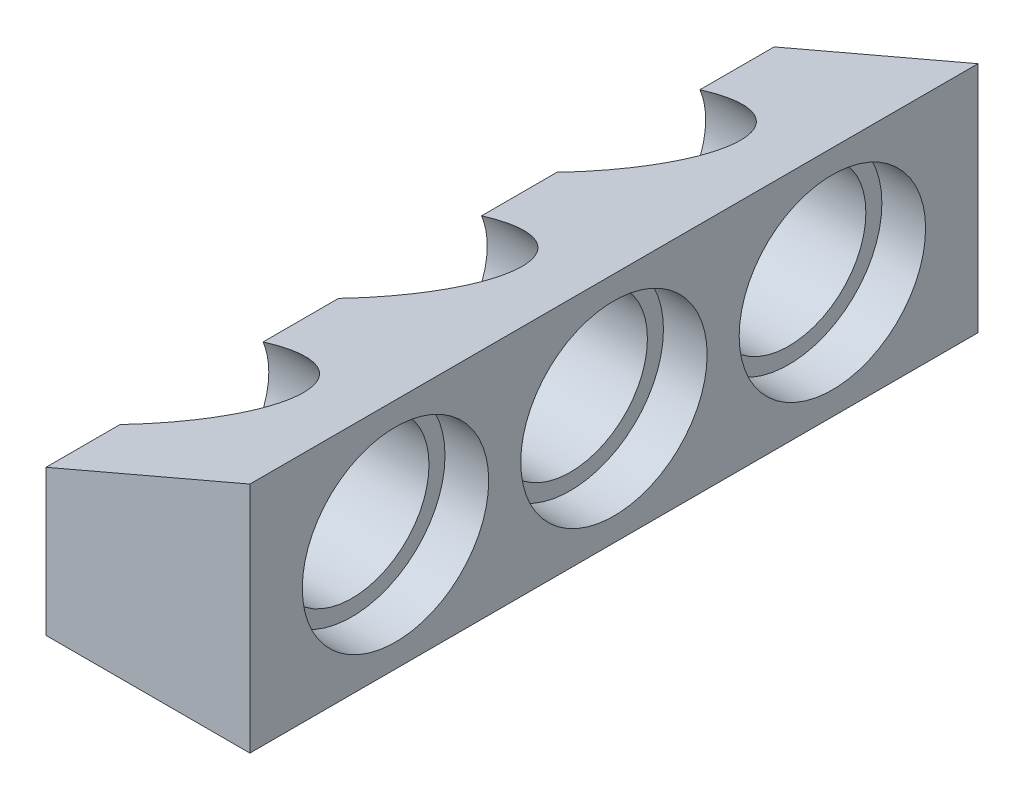
ISO-10303-21;
HEADER;
FILE_DESCRIPTION(('STEP AP214'),'2;1');
FILE_NAME('part.step','',(''),(''),'','','');
FILE_SCHEMA(('AUTOMOTIVE_DESIGN { 1 0 10303 214 1 1 1 1 }'));
ENDSEC;
DATA;
#1=APPLICATION_CONTEXT('core data for automotive mechanical design processes');
#2=APPLICATION_PROTOCOL_DEFINITION('international standard','automotive_design',2000,#1);
#3=PRODUCT_CONTEXT('',#1,'mechanical');
#4=PRODUCT('Part','Part','',(#3));
#5=PRODUCT_RELATED_PRODUCT_CATEGORY('part','',(#4));
#6=PRODUCT_DEFINITION_FORMATION('','',#4);
#7=PRODUCT_DEFINITION_CONTEXT('part definition',#1,'design');
#8=PRODUCT_DEFINITION('design','',#6,#7);
#9=PRODUCT_DEFINITION_SHAPE('','',#8);
#10=(LENGTH_UNIT() NAMED_UNIT(*) SI_UNIT(.MILLI.,.METRE.));
#11=(NAMED_UNIT(*) PLANE_ANGLE_UNIT() SI_UNIT($,.RADIAN.));
#12=(NAMED_UNIT(*) SI_UNIT($,.STERADIAN.) SOLID_ANGLE_UNIT());
#13=UNCERTAINTY_MEASURE_WITH_UNIT(LENGTH_MEASURE(1.E-05),#10,'distance_accuracy_value','');
#14=(GEOMETRIC_REPRESENTATION_CONTEXT(3) GLOBAL_UNCERTAINTY_ASSIGNED_CONTEXT((#13)) GLOBAL_UNIT_ASSIGNED_CONTEXT((#10,
#11,#12)) REPRESENTATION_CONTEXT('',''));
#15=CARTESIAN_POINT('',(0.,0.,0.));
#16=DIRECTION('',(0.,0.,1.));
#17=DIRECTION('',(1.,0.,0.));
#18=AXIS2_PLACEMENT_3D('',#15,#16,#17);
#19=CARTESIAN_POINT('',(7.,4.,20.));
#20=DIRECTION('',(-1.,0.,0.));
#21=DIRECTION('',(0.,-1.,0.));
#22=AXIS2_PLACEMENT_3D('',#19,#20,#21);
#23=CYLINDRICAL_SURFACE('',#22,2.65);
#24=CARTESIAN_POINT('',(0.,4.,20.));
#25=DIRECTION('',(-1.,0.,0.));
#26=DIRECTION('',(0.,-1.,0.));
#27=AXIS2_PLACEMENT_3D('',#24,#25,#26);
#28=CIRCLE('',#27,2.65);
#29=CARTESIAN_POINT('',(0.,5.,17.5459217616384));
#30=VERTEX_POINT('',#29);
#31=CARTESIAN_POINT('',(0.,5.,22.4540782383616));
#32=VERTEX_POINT('',#31);
#33=EDGE_CURVE('E102',#30,#32,#28,.T.);
#34=ORIENTED_EDGE('',*,*,#33,.T.);
#35=CARTESIAN_POINT('',(-2.33333333333334,4.,20.));
#36=DIRECTION('',(0.393919298579168,-0.919145030018058,0.));
#37=DIRECTION('',(-0.919145030018058,-0.393919298579168,0.));
#38=AXIS2_PLACEMENT_3D('',#35,#36,#37);
#39=ELLIPSE('',#38,6.72726624351312,2.65);
#40=EDGE_CURVE('E99',#30,#32,#39,.T.);
#41=ORIENTED_EDGE('',*,*,#40,.F.);
#42=EDGE_LOOP('',(#34,#41));
#43=FACE_BOUND('',#42,.T.);
#44=CARTESIAN_POINT('',(5.5,4.,20.));
#45=DIRECTION('',(1.,0.,0.));
#46=DIRECTION('',(0.,0.,-1.));
#47=AXIS2_PLACEMENT_3D('',#44,#45,#46);
#48=CIRCLE('',#47,2.65);
#49=CARTESIAN_POINT('',(5.5,4.,17.35));
#50=VERTEX_POINT('',#49);
#51=EDGE_CURVE('E43',#50,#50,#48,.F.);
#52=ORIENTED_EDGE('',*,*,#51,.F.);
#53=EDGE_LOOP('',(#52));
#54=FACE_BOUND('',#53,.T.);
#55=ADVANCED_FACE('F39',(#43,#54),#23,.F.);
#56=CARTESIAN_POINT('',(7.,4.,12.5));
#57=DIRECTION('',(-1.,0.,0.));
#58=DIRECTION('',(0.,-1.,0.));
#59=AXIS2_PLACEMENT_3D('',#56,#57,#58);
#60=CYLINDRICAL_SURFACE('',#59,2.65);
#61=CARTESIAN_POINT('',(0.,4.,12.5));
#62=DIRECTION('',(-1.,0.,0.));
#63=DIRECTION('',(0.,-1.,0.));
#64=AXIS2_PLACEMENT_3D('',#61,#62,#63);
#65=CIRCLE('',#64,2.65);
#66=CARTESIAN_POINT('',(0.,5.,10.0459217616384));
#67=VERTEX_POINT('',#66);
#68=CARTESIAN_POINT('',(0.,5.,14.9540782383616));
#69=VERTEX_POINT('',#68);
#70=EDGE_CURVE('E62',#67,#69,#65,.T.);
#71=ORIENTED_EDGE('',*,*,#70,.T.);
#72=CARTESIAN_POINT('',(-2.33333333333334,4.,12.5));
#73=DIRECTION('',(0.393919298579168,-0.919145030018058,0.));
#74=DIRECTION('',(-0.919145030018058,-0.393919298579168,0.));
#75=AXIS2_PLACEMENT_3D('',#72,#73,#74);
#76=ELLIPSE('',#75,6.72726624351311,2.65);
#77=EDGE_CURVE('E49',#67,#69,#76,.T.);
#78=ORIENTED_EDGE('',*,*,#77,.F.);
#79=EDGE_LOOP('',(#71,#78));
#80=FACE_BOUND('',#79,.T.);
#81=CARTESIAN_POINT('',(5.5,4.,12.5));
#82=DIRECTION('',(1.,0.,0.));
#83=DIRECTION('',(0.,0.,-1.));
#84=AXIS2_PLACEMENT_3D('',#81,#82,#83);
#85=CIRCLE('',#84,2.65);
#86=CARTESIAN_POINT('',(5.5,4.,9.85));
#87=VERTEX_POINT('',#86);
#88=EDGE_CURVE('E148',#87,#87,#85,.F.);
#89=ORIENTED_EDGE('',*,*,#88,.F.);
#90=EDGE_LOOP('',(#89));
#91=FACE_BOUND('',#90,.T.);
#92=ADVANCED_FACE('F162',(#80,#91),#60,.F.);
#93=CARTESIAN_POINT('',(7.,4.,5.));
#94=DIRECTION('',(-1.,0.,0.));
#95=DIRECTION('',(0.,-1.,0.));
#96=AXIS2_PLACEMENT_3D('',#93,#94,#95);
#97=CYLINDRICAL_SURFACE('',#96,2.65);
#98=CARTESIAN_POINT('',(0.,4.,5.));
#99=DIRECTION('',(-1.,0.,0.));
#100=DIRECTION('',(0.,-1.,0.));
#101=AXIS2_PLACEMENT_3D('',#98,#99,#100);
#102=CIRCLE('',#101,2.65);
#103=CARTESIAN_POINT('',(0.,5.,2.54592176163839));
#104=VERTEX_POINT('',#103);
#105=CARTESIAN_POINT('',(0.,5.,7.4540782383616));
#106=VERTEX_POINT('',#105);
#107=EDGE_CURVE('E56',#104,#106,#102,.T.);
#108=ORIENTED_EDGE('',*,*,#107,.T.);
#109=CARTESIAN_POINT('',(-2.33333333333334,4.,5.));
#110=DIRECTION('',(0.393919298579168,-0.919145030018058,0.));
#111=DIRECTION('',(-0.919145030018058,-0.393919298579168,0.));
#112=AXIS2_PLACEMENT_3D('',#109,#110,#111);
#113=ELLIPSE('',#112,6.72726624351312,2.65);
#114=EDGE_CURVE('E11',#104,#106,#113,.T.);
#115=ORIENTED_EDGE('',*,*,#114,.F.);
#116=EDGE_LOOP('',(#108,#115));
#117=FACE_BOUND('',#116,.T.);
#118=CARTESIAN_POINT('',(5.5,4.,5.));
#119=DIRECTION('',(1.,0.,0.));
#120=DIRECTION('',(0.,0.,-1.));
#121=AXIS2_PLACEMENT_3D('',#118,#119,#120);
#122=CIRCLE('',#121,2.65);
#123=CARTESIAN_POINT('',(5.5,4.,2.35));
#124=VERTEX_POINT('',#123);
#125=EDGE_CURVE('E145',#124,#124,#122,.F.);
#126=ORIENTED_EDGE('',*,*,#125,.F.);
#127=EDGE_LOOP('',(#126));
#128=FACE_BOUND('',#127,.T.);
#129=ADVANCED_FACE('F167',(#117,#128),#97,.F.);
#130=CARTESIAN_POINT('',(0.,5.,25.));
#131=DIRECTION('',(1.,0.,0.));
#132=DIRECTION('',(0.,1.,0.));
#133=AXIS2_PLACEMENT_3D('',#130,#131,#132);
#134=PLANE('',#133);
#135=DIRECTION('',(0.,0.,-1.));
#136=VECTOR('',#135,1.);
#137=CARTESIAN_POINT('',(0.,5.,25.));
#138=LINE('',#137,#136);
#139=EDGE_CURVE('E122',#67,#106,#138,.T.);
#140=ORIENTED_EDGE('',*,*,#139,.T.);
#141=ORIENTED_EDGE('',*,*,#107,.F.);
#142=CARTESIAN_POINT('',(0.,5.,0.));
#143=VERTEX_POINT('',#142);
#144=EDGE_CURVE('E128',#104,#143,#138,.T.);
#145=ORIENTED_EDGE('',*,*,#144,.T.);
#146=DIRECTION('',(0.,-1.,0.));
#147=VECTOR('',#146,1.);
#148=CARTESIAN_POINT('',(0.,5.,0.));
#149=LINE('',#148,#147);
#150=CARTESIAN_POINT('',(0.,0.,0.));
#151=VERTEX_POINT('',#150);
#152=EDGE_CURVE('E200',#143,#151,#149,.T.);
#153=ORIENTED_EDGE('',*,*,#152,.T.);
#154=DIRECTION('',(0.,0.,-1.));
#155=VECTOR('',#154,1.);
#156=CARTESIAN_POINT('',(0.,0.,25.));
#157=LINE('',#156,#155);
#158=CARTESIAN_POINT('',(0.,0.,25.));
#159=VERTEX_POINT('',#158);
#160=EDGE_CURVE('E108',#159,#151,#157,.T.);
#161=ORIENTED_EDGE('',*,*,#160,.F.);
#162=DIRECTION('',(0.,-1.,0.));
#163=VECTOR('',#162,1.);
#164=CARTESIAN_POINT('',(0.,5.,25.));
#165=LINE('',#164,#163);
#166=CARTESIAN_POINT('',(0.,5.,25.));
#167=VERTEX_POINT('',#166);
#168=EDGE_CURVE('E210',#167,#159,#165,.T.);
#169=ORIENTED_EDGE('',*,*,#168,.F.);
#170=EDGE_CURVE('E115',#167,#32,#138,.T.);
#171=ORIENTED_EDGE('',*,*,#170,.T.);
#172=ORIENTED_EDGE('',*,*,#33,.F.);
#173=EDGE_CURVE('E113',#30,#69,#138,.T.);
#174=ORIENTED_EDGE('',*,*,#173,.T.);
#175=ORIENTED_EDGE('',*,*,#70,.F.);
#176=EDGE_LOOP('',(#140,#141,#145,#153,#161,#169,#171,#172,#174,#175));
#177=FACE_BOUND('',#176,.T.);
#178=ADVANCED_FACE('F41',(#177),#134,.F.);
#179=CARTESIAN_POINT('',(0.,0.,25.));
#180=DIRECTION('',(0.,1.,0.));
#181=DIRECTION('',(0.,0.,1.));
#182=AXIS2_PLACEMENT_3D('',#179,#180,#181);
#183=PLANE('',#182);
#184=DIRECTION('',(1.,0.,0.));
#185=VECTOR('',#184,1.);
#186=CARTESIAN_POINT('',(0.,0.,0.));
#187=LINE('',#186,#185);
#188=CARTESIAN_POINT('',(7.,0.,0.));
#189=VERTEX_POINT('',#188);
#190=EDGE_CURVE('E192',#151,#189,#187,.T.);
#191=ORIENTED_EDGE('',*,*,#190,.T.);
#192=DIRECTION('',(0.,0.,-1.));
#193=VECTOR('',#192,1.);
#194=CARTESIAN_POINT('',(7.,0.,25.));
#195=LINE('',#194,#193);
#196=CARTESIAN_POINT('',(7.,0.,25.));
#197=VERTEX_POINT('',#196);
#198=EDGE_CURVE('E136',#197,#189,#195,.T.);
#199=ORIENTED_EDGE('',*,*,#198,.F.);
#200=DIRECTION('',(1.,0.,0.));
#201=VECTOR('',#200,1.);
#202=CARTESIAN_POINT('',(0.,0.,25.));
#203=LINE('',#202,#201);
#204=EDGE_CURVE('E219',#159,#197,#203,.T.);
#205=ORIENTED_EDGE('',*,*,#204,.F.);
#206=ORIENTED_EDGE('',*,*,#160,.T.);
#207=EDGE_LOOP('',(#191,#199,#205,#206));
#208=FACE_BOUND('',#207,.T.);
#209=ADVANCED_FACE('F184',(#208),#183,.F.);
#210=CARTESIAN_POINT('',(7.,0.,25.));
#211=DIRECTION('',(-1.,0.,0.));
#212=DIRECTION('',(0.,0.,1.));
#213=AXIS2_PLACEMENT_3D('',#210,#211,#212);
#214=PLANE('',#213);
#215=CARTESIAN_POINT('',(7.,4.,20.));
#216=DIRECTION('',(1.,0.,0.));
#217=DIRECTION('',(0.,0.,-1.));
#218=AXIS2_PLACEMENT_3D('',#215,#216,#217);
#219=CIRCLE('',#218,3.2);
#220=CARTESIAN_POINT('',(7.,4.,16.8));
#221=VERTEX_POINT('',#220);
#222=EDGE_CURVE('E245',#221,#221,#219,.T.);
#223=ORIENTED_EDGE('',*,*,#222,.F.);
#224=EDGE_LOOP('',(#223));
#225=FACE_BOUND('',#224,.T.);
#226=CARTESIAN_POINT('',(7.,4.,12.5));
#227=DIRECTION('',(1.,0.,0.));
#228=DIRECTION('',(0.,0.,-1.));
#229=AXIS2_PLACEMENT_3D('',#226,#227,#228);
#230=CIRCLE('',#229,3.2);
#231=CARTESIAN_POINT('',(7.,4.,9.3));
#232=VERTEX_POINT('',#231);
#233=EDGE_CURVE('E237',#232,#232,#230,.T.);
#234=ORIENTED_EDGE('',*,*,#233,.F.);
#235=EDGE_LOOP('',(#234));
#236=FACE_BOUND('',#235,.T.);
#237=CARTESIAN_POINT('',(7.,4.,5.));
#238=DIRECTION('',(1.,0.,0.));
#239=DIRECTION('',(0.,0.,-1.));
#240=AXIS2_PLACEMENT_3D('',#237,#238,#239);
#241=CIRCLE('',#240,3.2);
#242=CARTESIAN_POINT('',(7.,4.,1.8));
#243=VERTEX_POINT('',#242);
#244=EDGE_CURVE('E229',#243,#243,#241,.T.);
#245=ORIENTED_EDGE('',*,*,#244,.F.);
#246=EDGE_LOOP('',(#245));
#247=FACE_BOUND('',#246,.T.);
#248=DIRECTION('',(0.,1.,0.));
#249=VECTOR('',#248,1.);
#250=CARTESIAN_POINT('',(7.,0.,0.));
#251=LINE('',#250,#249);
#252=CARTESIAN_POINT('',(7.,8.,0.));
#253=VERTEX_POINT('',#252);
#254=EDGE_CURVE('E199',#189,#253,#251,.T.);
#255=ORIENTED_EDGE('',*,*,#254,.T.);
#256=DIRECTION('',(0.,0.,-1.));
#257=VECTOR('',#256,1.);
#258=CARTESIAN_POINT('',(7.,8.,25.));
#259=LINE('',#258,#257);
#260=CARTESIAN_POINT('',(7.,8.,25.));
#261=VERTEX_POINT('',#260);
#262=EDGE_CURVE('E127',#261,#253,#259,.T.);
#263=ORIENTED_EDGE('',*,*,#262,.F.);
#264=DIRECTION('',(0.,1.,0.));
#265=VECTOR('',#264,1.);
#266=CARTESIAN_POINT('',(7.,0.,25.));
#267=LINE('',#266,#265);
#268=EDGE_CURVE('E204',#197,#261,#267,.T.);
#269=ORIENTED_EDGE('',*,*,#268,.F.);
#270=ORIENTED_EDGE('',*,*,#198,.T.);
#271=EDGE_LOOP('',(#255,#263,#269,#270));
#272=FACE_BOUND('',#271,.T.);
#273=ADVANCED_FACE('F182',(#225,#236,#247,#272),#214,.F.);
#274=CARTESIAN_POINT('',(7.,8.,25.));
#275=DIRECTION('',(0.393919298579168,-0.919145030018058,0.));
#276=DIRECTION('',(0.919145030018058,0.393919298579168,0.));
#277=AXIS2_PLACEMENT_3D('',#274,#275,#276);
#278=PLANE('',#277);
#279=ORIENTED_EDGE('',*,*,#144,.F.);
#280=ORIENTED_EDGE('',*,*,#114,.T.);
#281=ORIENTED_EDGE('',*,*,#139,.F.);
#282=ORIENTED_EDGE('',*,*,#77,.T.);
#283=ORIENTED_EDGE('',*,*,#173,.F.);
#284=ORIENTED_EDGE('',*,*,#40,.T.);
#285=ORIENTED_EDGE('',*,*,#170,.F.);
#286=DIRECTION('',(-0.919145030018058,-0.393919298579168,0.));
#287=VECTOR('',#286,1.);
#288=CARTESIAN_POINT('',(7.,8.,25.));
#289=LINE('',#288,#287);
#290=EDGE_CURVE('E214',#261,#167,#289,.T.);
#291=ORIENTED_EDGE('',*,*,#290,.F.);
#292=ORIENTED_EDGE('',*,*,#262,.T.);
#293=DIRECTION('',(-0.919145030018058,-0.393919298579168,0.));
#294=VECTOR('',#293,1.);
#295=CARTESIAN_POINT('',(7.,8.,0.));
#296=LINE('',#295,#294);
#297=EDGE_CURVE('E131',#253,#143,#296,.T.);
#298=ORIENTED_EDGE('',*,*,#297,.T.);
#299=EDGE_LOOP('',(#279,#280,#281,#282,#283,#284,#285,#291,#292,#298));
#300=FACE_BOUND('',#299,.T.);
#301=ADVANCED_FACE('F119',(#300),#278,.F.);
#302=CARTESIAN_POINT('',(0.,0.,25.));
#303=DIRECTION('',(0.,0.,1.));
#304=DIRECTION('',(1.,0.,0.));
#305=AXIS2_PLACEMENT_3D('',#302,#303,#304);
#306=PLANE('',#305);
#307=ORIENTED_EDGE('',*,*,#168,.T.);
#308=ORIENTED_EDGE('',*,*,#204,.T.);
#309=ORIENTED_EDGE('',*,*,#268,.T.);
#310=ORIENTED_EDGE('',*,*,#290,.T.);
#311=EDGE_LOOP('',(#307,#308,#309,#310));
#312=FACE_BOUND('',#311,.T.);
#313=ADVANCED_FACE('F171',(#312),#306,.T.);
#314=CARTESIAN_POINT('',(0.,0.,0.));
#315=DIRECTION('',(0.,0.,1.));
#316=DIRECTION('',(1.,0.,0.));
#317=AXIS2_PLACEMENT_3D('',#314,#315,#316);
#318=PLANE('',#317);
#319=ORIENTED_EDGE('',*,*,#152,.F.);
#320=ORIENTED_EDGE('',*,*,#297,.F.);
#321=ORIENTED_EDGE('',*,*,#254,.F.);
#322=ORIENTED_EDGE('',*,*,#190,.F.);
#323=EDGE_LOOP('',(#319,#320,#321,#322));
#324=FACE_BOUND('',#323,.T.);
#325=ADVANCED_FACE('F174',(#324),#318,.F.);
#326=CARTESIAN_POINT('',(5.5,4.,5.));
#327=DIRECTION('',(1.,0.,0.));
#328=DIRECTION('',(0.,0.,-1.));
#329=AXIS2_PLACEMENT_3D('',#326,#327,#328);
#330=PLANE('',#329);
#331=CARTESIAN_POINT('',(5.5,4.,5.));
#332=DIRECTION('',(1.,0.,0.));
#333=DIRECTION('',(0.,0.,-1.));
#334=AXIS2_PLACEMENT_3D('',#331,#332,#333);
#335=CIRCLE('',#334,3.2);
#336=CARTESIAN_POINT('',(5.5,4.,1.8));
#337=VERTEX_POINT('',#336);
#338=EDGE_CURVE('E233',#337,#337,#335,.T.);
#339=ORIENTED_EDGE('',*,*,#338,.T.);
#340=EDGE_LOOP('',(#339));
#341=FACE_BOUND('',#340,.T.);
#342=ORIENTED_EDGE('',*,*,#125,.T.);
#343=EDGE_LOOP('',(#342));
#344=FACE_BOUND('',#343,.T.);
#345=ADVANCED_FACE('F178',(#341,#344),#330,.T.);
#346=CARTESIAN_POINT('',(5.5,4.,5.));
#347=DIRECTION('',(1.,0.,0.));
#348=DIRECTION('',(0.,0.,-1.));
#349=AXIS2_PLACEMENT_3D('',#346,#347,#348);
#350=CYLINDRICAL_SURFACE('',#349,3.2);
#351=ORIENTED_EDGE('',*,*,#338,.F.);
#352=EDGE_LOOP('',(#351));
#353=FACE_BOUND('',#352,.T.);
#354=ORIENTED_EDGE('',*,*,#244,.T.);
#355=EDGE_LOOP('',(#354));
#356=FACE_BOUND('',#355,.T.);
#357=ADVANCED_FACE('F265',(#353,#356),#350,.F.);
#358=CARTESIAN_POINT('',(5.5,4.,12.5));
#359=DIRECTION('',(1.,0.,0.));
#360=DIRECTION('',(0.,0.,-1.));
#361=AXIS2_PLACEMENT_3D('',#358,#359,#360);
#362=PLANE('',#361);
#363=CARTESIAN_POINT('',(5.5,4.,12.5));
#364=DIRECTION('',(1.,0.,0.));
#365=DIRECTION('',(0.,0.,-1.));
#366=AXIS2_PLACEMENT_3D('',#363,#364,#365);
#367=CIRCLE('',#366,3.2);
#368=CARTESIAN_POINT('',(5.5,4.,9.3));
#369=VERTEX_POINT('',#368);
#370=EDGE_CURVE('E241',#369,#369,#367,.T.);
#371=ORIENTED_EDGE('',*,*,#370,.T.);
#372=EDGE_LOOP('',(#371));
#373=FACE_BOUND('',#372,.T.);
#374=ORIENTED_EDGE('',*,*,#88,.T.);
#375=EDGE_LOOP('',(#374));
#376=FACE_BOUND('',#375,.T.);
#377=ADVANCED_FACE('F267',(#373,#376),#362,.T.);
#378=CARTESIAN_POINT('',(5.5,4.,12.5));
#379=DIRECTION('',(1.,0.,0.));
#380=DIRECTION('',(0.,0.,-1.));
#381=AXIS2_PLACEMENT_3D('',#378,#379,#380);
#382=CYLINDRICAL_SURFACE('',#381,3.2);
#383=ORIENTED_EDGE('',*,*,#370,.F.);
#384=EDGE_LOOP('',(#383));
#385=FACE_BOUND('',#384,.T.);
#386=ORIENTED_EDGE('',*,*,#233,.T.);
#387=EDGE_LOOP('',(#386));
#388=FACE_BOUND('',#387,.T.);
#389=ADVANCED_FACE('F274',(#385,#388),#382,.F.);
#390=CARTESIAN_POINT('',(5.5,4.,20.));
#391=DIRECTION('',(1.,0.,0.));
#392=DIRECTION('',(0.,0.,-1.));
#393=AXIS2_PLACEMENT_3D('',#390,#391,#392);
#394=PLANE('',#393);
#395=CARTESIAN_POINT('',(5.5,4.,20.));
#396=DIRECTION('',(1.,0.,0.));
#397=DIRECTION('',(0.,0.,-1.));
#398=AXIS2_PLACEMENT_3D('',#395,#396,#397);
#399=CIRCLE('',#398,3.2);
#400=CARTESIAN_POINT('',(5.5,4.,16.8));
#401=VERTEX_POINT('',#400);
#402=EDGE_CURVE('E149',#401,#401,#399,.T.);
#403=ORIENTED_EDGE('',*,*,#402,.T.);
#404=EDGE_LOOP('',(#403));
#405=FACE_BOUND('',#404,.T.);
#406=ORIENTED_EDGE('',*,*,#51,.T.);
#407=EDGE_LOOP('',(#406));
#408=FACE_BOUND('',#407,.T.);
#409=ADVANCED_FACE('F160',(#405,#408),#394,.T.);
#410=CARTESIAN_POINT('',(5.5,4.,20.));
#411=DIRECTION('',(1.,0.,0.));
#412=DIRECTION('',(0.,0.,-1.));
#413=AXIS2_PLACEMENT_3D('',#410,#411,#412);
#414=CYLINDRICAL_SURFACE('',#413,3.2);
#415=ORIENTED_EDGE('',*,*,#402,.F.);
#416=EDGE_LOOP('',(#415));
#417=FACE_BOUND('',#416,.T.);
#418=ORIENTED_EDGE('',*,*,#222,.T.);
#419=EDGE_LOOP('',(#418));
#420=FACE_BOUND('',#419,.T.);
#421=ADVANCED_FACE('F255',(#417,#420),#414,.F.);
#422=CLOSED_SHELL('',(#55,#92,#129,#178,#209,#273,#301,#313,#325,#345,#357,#377,#389,#409,#421));
#423=MANIFOLD_SOLID_BREP('B2',#422);
#424=ADVANCED_BREP_SHAPE_REPRESENTATION('',(#18,#423),#14);
#425=SHAPE_DEFINITION_REPRESENTATION(#9,#424);
ENDSEC;
END-ISO-10303-21;
